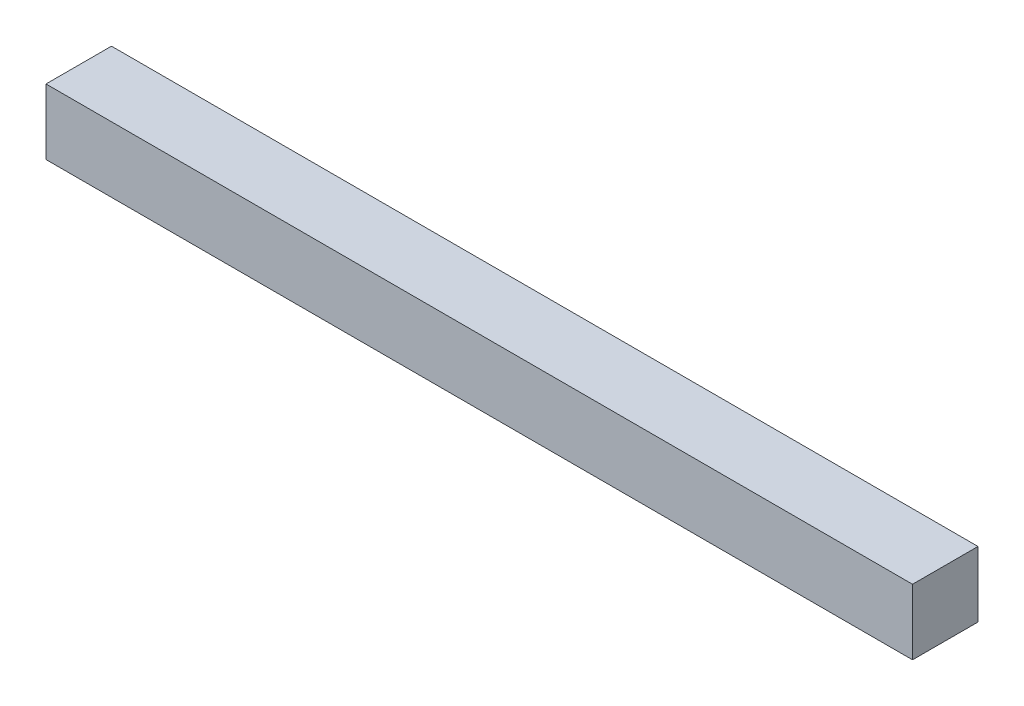
ISO-10303-21;
HEADER;
FILE_DESCRIPTION(('STEP AP214'),'2;1');
FILE_NAME('part.step','',(''),(''),'','','');
FILE_SCHEMA(('AUTOMOTIVE_DESIGN { 1 0 10303 214 1 1 1 1 }'));
ENDSEC;
DATA;
#1=APPLICATION_CONTEXT('core data for automotive mechanical design processes');
#2=APPLICATION_PROTOCOL_DEFINITION('international standard','automotive_design',2000,#1);
#3=PRODUCT_CONTEXT('',#1,'mechanical');
#4=PRODUCT('Part','Part','',(#3));
#5=PRODUCT_RELATED_PRODUCT_CATEGORY('part','',(#4));
#6=PRODUCT_DEFINITION_FORMATION('','',#4);
#7=PRODUCT_DEFINITION_CONTEXT('part definition',#1,'design');
#8=PRODUCT_DEFINITION('design','',#6,#7);
#9=PRODUCT_DEFINITION_SHAPE('','',#8);
#10=(LENGTH_UNIT() NAMED_UNIT(*) SI_UNIT(.MILLI.,.METRE.));
#11=(NAMED_UNIT(*) PLANE_ANGLE_UNIT() SI_UNIT($,.RADIAN.));
#12=(NAMED_UNIT(*) SI_UNIT($,.STERADIAN.) SOLID_ANGLE_UNIT());
#13=UNCERTAINTY_MEASURE_WITH_UNIT(LENGTH_MEASURE(1.E-05),#10,'distance_accuracy_value','');
#14=(GEOMETRIC_REPRESENTATION_CONTEXT(3) GLOBAL_UNCERTAINTY_ASSIGNED_CONTEXT((#13)) GLOBAL_UNIT_ASSIGNED_CONTEXT((#10,
#11,#12)) REPRESENTATION_CONTEXT('',''));
#15=CARTESIAN_POINT('',(0.,0.,0.));
#16=DIRECTION('',(0.,0.,1.));
#17=DIRECTION('',(1.,0.,0.));
#18=AXIS2_PLACEMENT_3D('',#15,#16,#17);
#19=CARTESIAN_POINT('',(198.5199992,0.,0.));
#20=DIRECTION('',(0.,0.,-1.));
#21=DIRECTION('',(-1.,0.,0.));
#22=AXIS2_PLACEMENT_3D('',#19,#20,#21);
#23=PLANE('',#22);
#24=DIRECTION('',(0.,-1.,0.));
#25=VECTOR('',#24,1.);
#26=CARTESIAN_POINT('',(0.,0.,0.));
#27=LINE('',#26,#25);
#28=CARTESIAN_POINT('',(0.,14.99997,0.));
#29=VERTEX_POINT('',#28);
#30=CARTESIAN_POINT('',(0.,0.,0.));
#31=VERTEX_POINT('',#30);
#32=EDGE_CURVE('E96',#29,#31,#27,.T.);
#33=ORIENTED_EDGE('',*,*,#32,.T.);
#34=DIRECTION('',(-1.,0.,0.));
#35=VECTOR('',#34,1.);
#36=CARTESIAN_POINT('',(198.5199992,0.,0.));
#37=LINE('',#36,#35);
#38=CARTESIAN_POINT('',(198.5199992,0.,0.));
#39=VERTEX_POINT('',#38);
#40=EDGE_CURVE('E11',#39,#31,#37,.T.);
#41=ORIENTED_EDGE('',*,*,#40,.F.);
#42=DIRECTION('',(0.,-1.,0.));
#43=VECTOR('',#42,1.);
#44=CARTESIAN_POINT('',(198.5199992,0.,0.));
#45=LINE('',#44,#43);
#46=CARTESIAN_POINT('',(198.5199992,14.99997,0.));
#47=VERTEX_POINT('',#46);
#48=EDGE_CURVE('E84',#47,#39,#45,.T.);
#49=ORIENTED_EDGE('',*,*,#48,.F.);
#50=DIRECTION('',(-1.,0.,0.));
#51=VECTOR('',#50,1.);
#52=CARTESIAN_POINT('',(198.5199992,14.99997,0.));
#53=LINE('',#52,#51);
#54=EDGE_CURVE('E92',#47,#29,#53,.T.);
#55=ORIENTED_EDGE('',*,*,#54,.T.);
#56=EDGE_LOOP('',(#33,#41,#49,#55));
#57=FACE_BOUND('',#56,.T.);
#58=ADVANCED_FACE('F33',(#57),#23,.F.);
#59=CARTESIAN_POINT('',(198.5199992,0.,0.));
#60=DIRECTION('',(0.,1.,0.));
#61=DIRECTION('',(0.,0.,1.));
#62=AXIS2_PLACEMENT_3D('',#59,#60,#61);
#63=PLANE('',#62);
#64=DIRECTION('',(0.,0.,-1.));
#65=VECTOR('',#64,1.);
#66=CARTESIAN_POINT('',(0.,0.,0.));
#67=LINE('',#66,#65);
#68=CARTESIAN_POINT('',(0.,0.,-14.99997));
#69=VERTEX_POINT('',#68);
#70=EDGE_CURVE('E88',#31,#69,#67,.T.);
#71=ORIENTED_EDGE('',*,*,#70,.T.);
#72=DIRECTION('',(-1.,0.,0.));
#73=VECTOR('',#72,1.);
#74=CARTESIAN_POINT('',(198.5199992,0.,-14.99997));
#75=LINE('',#74,#73);
#76=CARTESIAN_POINT('',(198.5199992,0.,-14.99997));
#77=VERTEX_POINT('',#76);
#78=EDGE_CURVE('E41',#77,#69,#75,.T.);
#79=ORIENTED_EDGE('',*,*,#78,.F.);
#80=DIRECTION('',(0.,0.,-1.));
#81=VECTOR('',#80,1.);
#82=CARTESIAN_POINT('',(198.5199992,0.,0.));
#83=LINE('',#82,#81);
#84=EDGE_CURVE('E79',#39,#77,#83,.T.);
#85=ORIENTED_EDGE('',*,*,#84,.F.);
#86=ORIENTED_EDGE('',*,*,#40,.T.);
#87=EDGE_LOOP('',(#71,#79,#85,#86));
#88=FACE_BOUND('',#87,.T.);
#89=ADVANCED_FACE('F87',(#88),#63,.F.);
#90=CARTESIAN_POINT('',(198.5199992,0.,-14.99997));
#91=DIRECTION('',(0.,0.,1.));
#92=DIRECTION('',(1.,0.,0.));
#93=AXIS2_PLACEMENT_3D('',#90,#91,#92);
#94=PLANE('',#93);
#95=DIRECTION('',(0.,1.,0.));
#96=VECTOR('',#95,1.);
#97=CARTESIAN_POINT('',(0.,0.,-14.99997));
#98=LINE('',#97,#96);
#99=CARTESIAN_POINT('',(0.,14.99997,-14.99997));
#100=VERTEX_POINT('',#99);
#101=EDGE_CURVE('E66',#69,#100,#98,.T.);
#102=ORIENTED_EDGE('',*,*,#101,.T.);
#103=DIRECTION('',(-1.,0.,0.));
#104=VECTOR('',#103,1.);
#105=CARTESIAN_POINT('',(198.5199992,14.99997,-14.99997));
#106=LINE('',#105,#104);
#107=CARTESIAN_POINT('',(198.5199992,14.99997,-14.99997));
#108=VERTEX_POINT('',#107);
#109=EDGE_CURVE('E89',#108,#100,#106,.T.);
#110=ORIENTED_EDGE('',*,*,#109,.F.);
#111=DIRECTION('',(0.,1.,0.));
#112=VECTOR('',#111,1.);
#113=CARTESIAN_POINT('',(198.5199992,0.,-14.99997));
#114=LINE('',#113,#112);
#115=EDGE_CURVE('E82',#77,#108,#114,.T.);
#116=ORIENTED_EDGE('',*,*,#115,.F.);
#117=ORIENTED_EDGE('',*,*,#78,.T.);
#118=EDGE_LOOP('',(#102,#110,#116,#117));
#119=FACE_BOUND('',#118,.T.);
#120=ADVANCED_FACE('F90',(#119),#94,.F.);
#121=CARTESIAN_POINT('',(198.5199992,14.99997,0.));
#122=DIRECTION('',(0.,-1.,0.));
#123=DIRECTION('',(0.,0.,-1.));
#124=AXIS2_PLACEMENT_3D('',#121,#122,#123);
#125=PLANE('',#124);
#126=DIRECTION('',(0.,0.,1.));
#127=VECTOR('',#126,1.);
#128=CARTESIAN_POINT('',(0.,14.99997,0.));
#129=LINE('',#128,#127);
#130=EDGE_CURVE('E72',#100,#29,#129,.T.);
#131=ORIENTED_EDGE('',*,*,#130,.T.);
#132=ORIENTED_EDGE('',*,*,#54,.F.);
#133=DIRECTION('',(0.,0.,1.));
#134=VECTOR('',#133,1.);
#135=CARTESIAN_POINT('',(198.5199992,14.99997,0.));
#136=LINE('',#135,#134);
#137=EDGE_CURVE('E49',#108,#47,#136,.T.);
#138=ORIENTED_EDGE('',*,*,#137,.F.);
#139=ORIENTED_EDGE('',*,*,#109,.T.);
#140=EDGE_LOOP('',(#131,#132,#138,#139));
#141=FACE_BOUND('',#140,.T.);
#142=ADVANCED_FACE('F103',(#141),#125,.F.);
#143=CARTESIAN_POINT('',(198.5199992,0.,0.));
#144=DIRECTION('',(-1.,0.,0.));
#145=DIRECTION('',(0.,0.,1.));
#146=AXIS2_PLACEMENT_3D('',#143,#144,#145);
#147=PLANE('',#146);
#148=ORIENTED_EDGE('',*,*,#48,.T.);
#149=ORIENTED_EDGE('',*,*,#84,.T.);
#150=ORIENTED_EDGE('',*,*,#115,.T.);
#151=ORIENTED_EDGE('',*,*,#137,.T.);
#152=EDGE_LOOP('',(#148,#149,#150,#151));
#153=FACE_BOUND('',#152,.T.);
#154=ADVANCED_FACE('F80',(#153),#147,.F.);
#155=CARTESIAN_POINT('',(0.,0.,0.));
#156=DIRECTION('',(-1.,0.,0.));
#157=DIRECTION('',(0.,0.,1.));
#158=AXIS2_PLACEMENT_3D('',#155,#156,#157);
#159=PLANE('',#158);
#160=ORIENTED_EDGE('',*,*,#32,.F.);
#161=ORIENTED_EDGE('',*,*,#130,.F.);
#162=ORIENTED_EDGE('',*,*,#101,.F.);
#163=ORIENTED_EDGE('',*,*,#70,.F.);
#164=EDGE_LOOP('',(#160,#161,#162,#163));
#165=FACE_BOUND('',#164,.T.);
#166=ADVANCED_FACE('F106',(#165),#159,.T.);
#167=CLOSED_SHELL('',(#58,#89,#120,#142,#154,#166));
#168=MANIFOLD_SOLID_BREP('B2',#167);
#169=ADVANCED_BREP_SHAPE_REPRESENTATION('',(#18,#168),#14);
#170=SHAPE_DEFINITION_REPRESENTATION(#9,#169);
ENDSEC;
END-ISO-10303-21;
